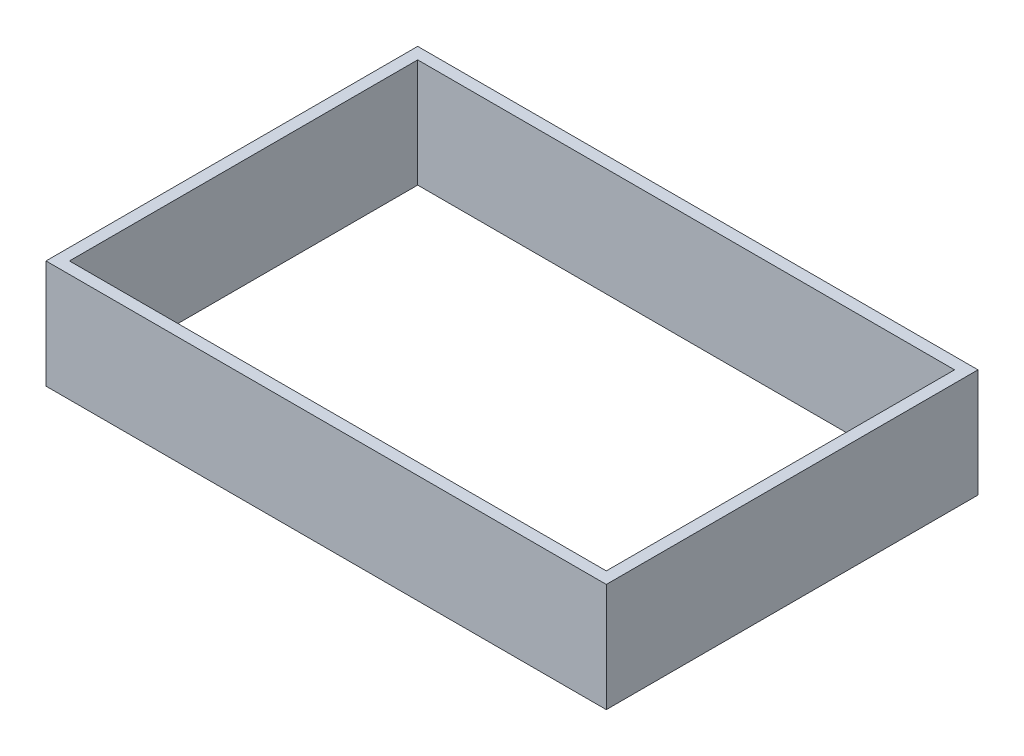
ISO-10303-21;
HEADER;
FILE_DESCRIPTION(('STEP AP214'),'2;1');
FILE_NAME('part.step','',(''),(''),'','','');
FILE_SCHEMA(('AUTOMOTIVE_DESIGN { 1 0 10303 214 1 1 1 1 }'));
ENDSEC;
DATA;
#1=APPLICATION_CONTEXT('core data for automotive mechanical design processes');
#2=APPLICATION_PROTOCOL_DEFINITION('international standard','automotive_design',2000,#1);
#3=PRODUCT_CONTEXT('',#1,'mechanical');
#4=PRODUCT('Part','Part','',(#3));
#5=PRODUCT_RELATED_PRODUCT_CATEGORY('part','',(#4));
#6=PRODUCT_DEFINITION_FORMATION('','',#4);
#7=PRODUCT_DEFINITION_CONTEXT('part definition',#1,'design');
#8=PRODUCT_DEFINITION('design','',#6,#7);
#9=PRODUCT_DEFINITION_SHAPE('','',#8);
#10=(LENGTH_UNIT() NAMED_UNIT(*) SI_UNIT(.MILLI.,.METRE.));
#11=(NAMED_UNIT(*) PLANE_ANGLE_UNIT() SI_UNIT($,.RADIAN.));
#12=(NAMED_UNIT(*) SI_UNIT($,.STERADIAN.) SOLID_ANGLE_UNIT());
#13=UNCERTAINTY_MEASURE_WITH_UNIT(LENGTH_MEASURE(1.E-05),#10,'distance_accuracy_value','');
#14=(GEOMETRIC_REPRESENTATION_CONTEXT(3) GLOBAL_UNCERTAINTY_ASSIGNED_CONTEXT((#13)) GLOBAL_UNIT_ASSIGNED_CONTEXT((#10,
#11,#12)) REPRESENTATION_CONTEXT('',''));
#15=CARTESIAN_POINT('',(0.,0.,0.));
#16=DIRECTION('',(0.,0.,1.));
#17=DIRECTION('',(1.,0.,0.));
#18=AXIS2_PLACEMENT_3D('',#15,#16,#17);
#19=CARTESIAN_POINT('',(-0.199999999999998,-18.5,0.));
#20=DIRECTION('',(-1.,0.,0.));
#21=DIRECTION('',(0.,0.,1.));
#22=AXIS2_PLACEMENT_3D('',#19,#20,#21);
#23=PLANE('',#22);
#24=DIRECTION('',(0.,0.,1.));
#25=VECTOR('',#24,1.);
#26=CARTESIAN_POINT('',(-0.199999999999998,0.,0.));
#27=LINE('',#26,#25);
#28=CARTESIAN_POINT('',(-0.2,0.,-59.2));
#29=VERTEX_POINT('',#28);
#30=CARTESIAN_POINT('',(-0.199999999999998,0.,0.199999999999999));
#31=VERTEX_POINT('',#30);
#32=EDGE_CURVE('E162',#29,#31,#27,.T.);
#33=ORIENTED_EDGE('',*,*,#32,.T.);
#34=DIRECTION('',(0.,1.,0.));
#35=VECTOR('',#34,1.);
#36=CARTESIAN_POINT('',(-0.199999999999998,-18.5,0.199999999999999));
#37=LINE('',#36,#35);
#38=CARTESIAN_POINT('',(-0.199999999999998,-18.5,0.199999999999999));
#39=VERTEX_POINT('',#38);
#40=EDGE_CURVE('E11',#39,#31,#37,.T.);
#41=ORIENTED_EDGE('',*,*,#40,.F.);
#42=DIRECTION('',(0.,0.,1.));
#43=VECTOR('',#42,1.);
#44=CARTESIAN_POINT('',(-0.199999999999998,-18.5,0.));
#45=LINE('',#44,#43);
#46=CARTESIAN_POINT('',(-0.2,-18.5,-59.2));
#47=VERTEX_POINT('',#46);
#48=EDGE_CURVE('E137',#47,#39,#45,.T.);
#49=ORIENTED_EDGE('',*,*,#48,.F.);
#50=DIRECTION('',(0.,1.,0.));
#51=VECTOR('',#50,1.);
#52=CARTESIAN_POINT('',(-0.2,-18.5,-59.2));
#53=LINE('',#52,#51);
#54=EDGE_CURVE('E126',#47,#29,#53,.T.);
#55=ORIENTED_EDGE('',*,*,#54,.T.);
#56=EDGE_LOOP('',(#33,#41,#49,#55));
#57=FACE_BOUND('',#56,.T.);
#58=ADVANCED_FACE('F43',(#57),#23,.F.);
#59=CARTESIAN_POINT('',(0.,-18.5,0.199999999999999));
#60=DIRECTION('',(0.,0.,1.));
#61=DIRECTION('',(1.,0.,0.));
#62=AXIS2_PLACEMENT_3D('',#59,#60,#61);
#63=PLANE('',#62);
#64=DIRECTION('',(1.,0.,0.));
#65=VECTOR('',#64,1.);
#66=CARTESIAN_POINT('',(0.,0.,0.199999999999999));
#67=LINE('',#66,#65);
#68=CARTESIAN_POINT('',(91.37,0.,0.199999999999999));
#69=VERTEX_POINT('',#68);
#70=EDGE_CURVE('E96',#31,#69,#67,.T.);
#71=ORIENTED_EDGE('',*,*,#70,.T.);
#72=DIRECTION('',(0.,1.,0.));
#73=VECTOR('',#72,1.);
#74=CARTESIAN_POINT('',(91.37,-18.5,0.199999999999999));
#75=LINE('',#74,#73);
#76=CARTESIAN_POINT('',(91.37,-18.5,0.199999999999999));
#77=VERTEX_POINT('',#76);
#78=EDGE_CURVE('E54',#77,#69,#75,.T.);
#79=ORIENTED_EDGE('',*,*,#78,.F.);
#80=DIRECTION('',(1.,0.,0.));
#81=VECTOR('',#80,1.);
#82=CARTESIAN_POINT('',(0.,-18.5,0.199999999999999));
#83=LINE('',#82,#81);
#84=EDGE_CURVE('E62',#39,#77,#83,.T.);
#85=ORIENTED_EDGE('',*,*,#84,.F.);
#86=ORIENTED_EDGE('',*,*,#40,.T.);
#87=EDGE_LOOP('',(#71,#79,#85,#86));
#88=FACE_BOUND('',#87,.T.);
#89=ADVANCED_FACE('F207',(#88),#63,.F.);
#90=CARTESIAN_POINT('',(91.37,-18.5,0.));
#91=DIRECTION('',(-1.,0.,0.));
#92=DIRECTION('',(0.,0.,1.));
#93=AXIS2_PLACEMENT_3D('',#90,#91,#92);
#94=PLANE('',#93);
#95=DIRECTION('',(0.,0.,1.));
#96=VECTOR('',#95,1.);
#97=CARTESIAN_POINT('',(91.37,0.,0.));
#98=LINE('',#97,#96);
#99=CARTESIAN_POINT('',(91.37,0.,-59.2));
#100=VERTEX_POINT('',#99);
#101=EDGE_CURVE('E120',#100,#69,#98,.T.);
#102=ORIENTED_EDGE('',*,*,#101,.F.);
#103=DIRECTION('',(0.,1.,0.));
#104=VECTOR('',#103,1.);
#105=CARTESIAN_POINT('',(91.37,-18.5,-59.2));
#106=LINE('',#105,#104);
#107=CARTESIAN_POINT('',(91.37,-18.5,-59.2));
#108=VERTEX_POINT('',#107);
#109=EDGE_CURVE('E116',#108,#100,#106,.T.);
#110=ORIENTED_EDGE('',*,*,#109,.F.);
#111=DIRECTION('',(0.,0.,1.));
#112=VECTOR('',#111,1.);
#113=CARTESIAN_POINT('',(91.37,-18.5,0.));
#114=LINE('',#113,#112);
#115=EDGE_CURVE('E119',#108,#77,#114,.T.);
#116=ORIENTED_EDGE('',*,*,#115,.T.);
#117=ORIENTED_EDGE('',*,*,#78,.T.);
#118=EDGE_LOOP('',(#102,#110,#116,#117));
#119=FACE_BOUND('',#118,.T.);
#120=ADVANCED_FACE('F118',(#119),#94,.T.);
#121=CARTESIAN_POINT('',(0.,-18.5,-61.2));
#122=DIRECTION('',(0.,0.,1.));
#123=DIRECTION('',(1.,0.,0.));
#124=AXIS2_PLACEMENT_3D('',#121,#122,#123);
#125=PLANE('',#124);
#126=DIRECTION('',(1.,0.,0.));
#127=VECTOR('',#126,1.);
#128=CARTESIAN_POINT('',(0.,0.,-61.2));
#129=LINE('',#128,#127);
#130=CARTESIAN_POINT('',(-2.2,0.,-61.2));
#131=VERTEX_POINT('',#130);
#132=CARTESIAN_POINT('',(93.37,0.,-61.2));
#133=VERTEX_POINT('',#132);
#134=EDGE_CURVE('E146',#131,#133,#129,.T.);
#135=ORIENTED_EDGE('',*,*,#134,.T.);
#136=DIRECTION('',(0.,1.,0.));
#137=VECTOR('',#136,1.);
#138=CARTESIAN_POINT('',(93.37,-18.5,-61.2));
#139=LINE('',#138,#137);
#140=CARTESIAN_POINT('',(93.37,-18.5,-61.2));
#141=VERTEX_POINT('',#140);
#142=EDGE_CURVE('E178',#141,#133,#139,.T.);
#143=ORIENTED_EDGE('',*,*,#142,.F.);
#144=DIRECTION('',(1.,0.,0.));
#145=VECTOR('',#144,1.);
#146=CARTESIAN_POINT('',(0.,-18.5,-61.2));
#147=LINE('',#146,#145);
#148=CARTESIAN_POINT('',(-2.2,-18.5,-61.2));
#149=VERTEX_POINT('',#148);
#150=EDGE_CURVE('E172',#149,#141,#147,.T.);
#151=ORIENTED_EDGE('',*,*,#150,.F.);
#152=DIRECTION('',(0.,1.,0.));
#153=VECTOR('',#152,1.);
#154=CARTESIAN_POINT('',(-2.2,-18.5,-61.2));
#155=LINE('',#154,#153);
#156=EDGE_CURVE('E47',#149,#131,#155,.T.);
#157=ORIENTED_EDGE('',*,*,#156,.T.);
#158=EDGE_LOOP('',(#135,#143,#151,#157));
#159=FACE_BOUND('',#158,.T.);
#160=ADVANCED_FACE('F45',(#159),#125,.F.);
#161=CARTESIAN_POINT('',(93.37,-18.5,0.));
#162=DIRECTION('',(-1.,0.,0.));
#163=DIRECTION('',(0.,0.,1.));
#164=AXIS2_PLACEMENT_3D('',#161,#162,#163);
#165=PLANE('',#164);
#166=DIRECTION('',(0.,0.,1.));
#167=VECTOR('',#166,1.);
#168=CARTESIAN_POINT('',(93.37,0.,0.));
#169=LINE('',#168,#167);
#170=CARTESIAN_POINT('',(93.37,0.,2.19999999999999));
#171=VERTEX_POINT('',#170);
#172=EDGE_CURVE('E158',#133,#171,#169,.T.);
#173=ORIENTED_EDGE('',*,*,#172,.T.);
#174=DIRECTION('',(0.,1.,0.));
#175=VECTOR('',#174,1.);
#176=CARTESIAN_POINT('',(93.37,-18.5,2.19999999999999));
#177=LINE('',#176,#175);
#178=CARTESIAN_POINT('',(93.37,-18.5,2.19999999999999));
#179=VERTEX_POINT('',#178);
#180=EDGE_CURVE('E182',#179,#171,#177,.T.);
#181=ORIENTED_EDGE('',*,*,#180,.F.);
#182=DIRECTION('',(0.,0.,1.));
#183=VECTOR('',#182,1.);
#184=CARTESIAN_POINT('',(93.37,-18.5,0.));
#185=LINE('',#184,#183);
#186=EDGE_CURVE('E140',#141,#179,#185,.T.);
#187=ORIENTED_EDGE('',*,*,#186,.F.);
#188=ORIENTED_EDGE('',*,*,#142,.T.);
#189=EDGE_LOOP('',(#173,#181,#187,#188));
#190=FACE_BOUND('',#189,.T.);
#191=ADVANCED_FACE('F203',(#190),#165,.F.);
#192=CARTESIAN_POINT('',(0.,-18.5,2.2));
#193=DIRECTION('',(0.,0.,1.));
#194=DIRECTION('',(1.,0.,0.));
#195=AXIS2_PLACEMENT_3D('',#192,#193,#194);
#196=PLANE('',#195);
#197=DIRECTION('',(1.,0.,0.));
#198=VECTOR('',#197,1.);
#199=CARTESIAN_POINT('',(0.,0.,2.2));
#200=LINE('',#199,#198);
#201=CARTESIAN_POINT('',(-2.19999999999999,0.,2.2));
#202=VERTEX_POINT('',#201);
#203=EDGE_CURVE('E154',#202,#171,#200,.T.);
#204=ORIENTED_EDGE('',*,*,#203,.F.);
#205=DIRECTION('',(0.,1.,0.));
#206=VECTOR('',#205,1.);
#207=CARTESIAN_POINT('',(-2.19999999999999,-18.5,2.2));
#208=LINE('',#207,#206);
#209=CARTESIAN_POINT('',(-2.19999999999999,-18.5,2.2));
#210=VERTEX_POINT('',#209);
#211=EDGE_CURVE('E184',#210,#202,#208,.T.);
#212=ORIENTED_EDGE('',*,*,#211,.F.);
#213=DIRECTION('',(1.,0.,0.));
#214=VECTOR('',#213,1.);
#215=CARTESIAN_POINT('',(0.,-18.5,2.2));
#216=LINE('',#215,#214);
#217=EDGE_CURVE('E224',#210,#179,#216,.T.);
#218=ORIENTED_EDGE('',*,*,#217,.T.);
#219=ORIENTED_EDGE('',*,*,#180,.T.);
#220=EDGE_LOOP('',(#204,#212,#218,#219));
#221=FACE_BOUND('',#220,.T.);
#222=ADVANCED_FACE('F197',(#221),#196,.T.);
#223=CARTESIAN_POINT('',(-2.19999999999999,-18.5,0.));
#224=DIRECTION('',(-1.,0.,0.));
#225=DIRECTION('',(0.,0.,1.));
#226=AXIS2_PLACEMENT_3D('',#223,#224,#225);
#227=PLANE('',#226);
#228=DIRECTION('',(0.,0.,1.));
#229=VECTOR('',#228,1.);
#230=CARTESIAN_POINT('',(-2.19999999999999,0.,0.));
#231=LINE('',#230,#229);
#232=EDGE_CURVE('E150',#131,#202,#231,.T.);
#233=ORIENTED_EDGE('',*,*,#232,.F.);
#234=ORIENTED_EDGE('',*,*,#156,.F.);
#235=DIRECTION('',(0.,0.,1.));
#236=VECTOR('',#235,1.);
#237=CARTESIAN_POINT('',(-2.19999999999999,-18.5,0.));
#238=LINE('',#237,#236);
#239=EDGE_CURVE('E227',#149,#210,#238,.T.);
#240=ORIENTED_EDGE('',*,*,#239,.T.);
#241=ORIENTED_EDGE('',*,*,#211,.T.);
#242=EDGE_LOOP('',(#233,#234,#240,#241));
#243=FACE_BOUND('',#242,.T.);
#244=ADVANCED_FACE('F195',(#243),#227,.T.);
#245=CARTESIAN_POINT('',(0.,-18.5,-59.2));
#246=DIRECTION('',(0.,0.,1.));
#247=DIRECTION('',(1.,0.,0.));
#248=AXIS2_PLACEMENT_3D('',#245,#246,#247);
#249=PLANE('',#248);
#250=DIRECTION('',(1.,0.,0.));
#251=VECTOR('',#250,1.);
#252=CARTESIAN_POINT('',(0.,0.,-59.2));
#253=LINE('',#252,#251);
#254=EDGE_CURVE('E166',#29,#100,#253,.T.);
#255=ORIENTED_EDGE('',*,*,#254,.F.);
#256=ORIENTED_EDGE('',*,*,#54,.F.);
#257=DIRECTION('',(1.,0.,0.));
#258=VECTOR('',#257,1.);
#259=CARTESIAN_POINT('',(0.,-18.5,-59.2));
#260=LINE('',#259,#258);
#261=EDGE_CURVE('E131',#47,#108,#260,.T.);
#262=ORIENTED_EDGE('',*,*,#261,.T.);
#263=ORIENTED_EDGE('',*,*,#109,.T.);
#264=EDGE_LOOP('',(#255,#256,#262,#263));
#265=FACE_BOUND('',#264,.T.);
#266=ADVANCED_FACE('F134',(#265),#249,.T.);
#267=CARTESIAN_POINT('',(0.,-18.5,0.));
#268=DIRECTION('',(0.,1.,0.));
#269=DIRECTION('',(0.,0.,1.));
#270=AXIS2_PLACEMENT_3D('',#267,#268,#269);
#271=PLANE('',#270);
#272=ORIENTED_EDGE('',*,*,#150,.T.);
#273=ORIENTED_EDGE('',*,*,#186,.T.);
#274=ORIENTED_EDGE('',*,*,#217,.F.);
#275=ORIENTED_EDGE('',*,*,#239,.F.);
#276=EDGE_LOOP('',(#272,#273,#274,#275));
#277=FACE_BOUND('',#276,.T.);
#278=ORIENTED_EDGE('',*,*,#48,.T.);
#279=ORIENTED_EDGE('',*,*,#84,.T.);
#280=ORIENTED_EDGE('',*,*,#115,.F.);
#281=ORIENTED_EDGE('',*,*,#261,.F.);
#282=EDGE_LOOP('',(#278,#279,#280,#281));
#283=FACE_BOUND('',#282,.T.);
#284=ADVANCED_FACE('F130',(#277,#283),#271,.F.);
#285=CARTESIAN_POINT('',(0.,0.,0.));
#286=DIRECTION('',(0.,1.,0.));
#287=DIRECTION('',(0.,0.,1.));
#288=AXIS2_PLACEMENT_3D('',#285,#286,#287);
#289=PLANE('',#288);
#290=ORIENTED_EDGE('',*,*,#134,.F.);
#291=ORIENTED_EDGE('',*,*,#232,.T.);
#292=ORIENTED_EDGE('',*,*,#203,.T.);
#293=ORIENTED_EDGE('',*,*,#172,.F.);
#294=EDGE_LOOP('',(#290,#291,#292,#293));
#295=FACE_BOUND('',#294,.T.);
#296=ORIENTED_EDGE('',*,*,#32,.F.);
#297=ORIENTED_EDGE('',*,*,#254,.T.);
#298=ORIENTED_EDGE('',*,*,#101,.T.);
#299=ORIENTED_EDGE('',*,*,#70,.F.);
#300=EDGE_LOOP('',(#296,#297,#298,#299));
#301=FACE_BOUND('',#300,.T.);
#302=ADVANCED_FACE('F194',(#295,#301),#289,.T.);
#303=CLOSED_SHELL('',(#58,#89,#120,#160,#191,#222,#244,#266,#284,#302));
#304=MANIFOLD_SOLID_BREP('B2',#303);
#305=ADVANCED_BREP_SHAPE_REPRESENTATION('',(#18,#304),#14);
#306=SHAPE_DEFINITION_REPRESENTATION(#9,#305);
ENDSEC;
END-ISO-10303-21;
